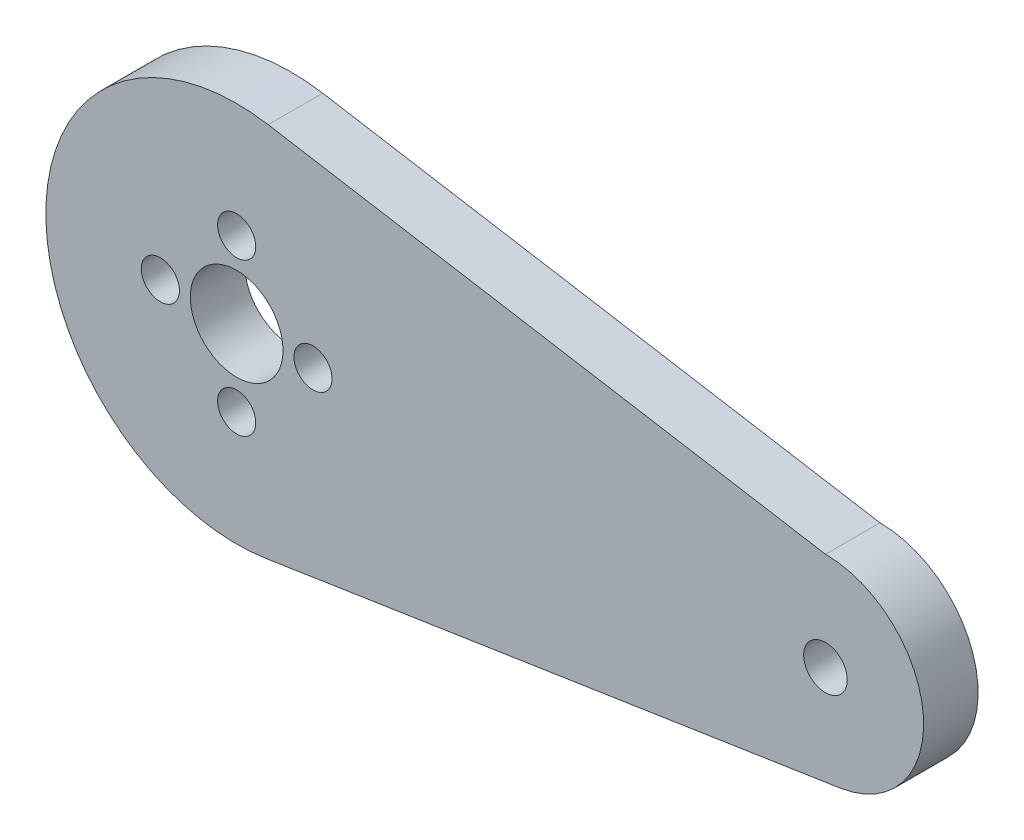
ISO-10303-21;
HEADER;
FILE_DESCRIPTION(('STEP AP214'),'2;1');
FILE_NAME('part.step','',(''),(''),'','','');
FILE_SCHEMA(('AUTOMOTIVE_DESIGN { 1 0 10303 214 1 1 1 1 }'));
ENDSEC;
DATA;
#1=APPLICATION_CONTEXT('core data for automotive mechanical design processes');
#2=APPLICATION_PROTOCOL_DEFINITION('international standard','automotive_design',2000,#1);
#3=PRODUCT_CONTEXT('',#1,'mechanical');
#4=PRODUCT('Part','Part','',(#3));
#5=PRODUCT_RELATED_PRODUCT_CATEGORY('part','',(#4));
#6=PRODUCT_DEFINITION_FORMATION('','',#4);
#7=PRODUCT_DEFINITION_CONTEXT('part definition',#1,'design');
#8=PRODUCT_DEFINITION('design','',#6,#7);
#9=PRODUCT_DEFINITION_SHAPE('','',#8);
#10=(LENGTH_UNIT() NAMED_UNIT(*) SI_UNIT(.MILLI.,.METRE.));
#11=(NAMED_UNIT(*) PLANE_ANGLE_UNIT() SI_UNIT($,.RADIAN.));
#12=(NAMED_UNIT(*) SI_UNIT($,.STERADIAN.) SOLID_ANGLE_UNIT());
#13=UNCERTAINTY_MEASURE_WITH_UNIT(LENGTH_MEASURE(1.E-05),#10,'distance_accuracy_value','');
#14=(GEOMETRIC_REPRESENTATION_CONTEXT(3) GLOBAL_UNCERTAINTY_ASSIGNED_CONTEXT((#13)) GLOBAL_UNIT_ASSIGNED_CONTEXT((#10,
#11,#12)) REPRESENTATION_CONTEXT('',''));
#15=CARTESIAN_POINT('',(0.,0.,0.));
#16=DIRECTION('',(0.,0.,1.));
#17=DIRECTION('',(1.,0.,0.));
#18=AXIS2_PLACEMENT_3D('',#15,#16,#17);
#19=CARTESIAN_POINT('',(-20.2199999704329,57.5799999999971,-5.));
#20=DIRECTION('',(0.,0.,1.));
#21=DIRECTION('',(1.,0.,0.));
#22=AXIS2_PLACEMENT_3D('',#19,#20,#21);
#23=CYLINDRICAL_SURFACE('',#22,17.500000000001);
#24=CARTESIAN_POINT('',(-20.2199999704329,57.5799999999971,0.));
#25=DIRECTION('',(0.,0.,1.));
#26=DIRECTION('',(1.,0.,0.));
#27=AXIS2_PLACEMENT_3D('',#24,#25,#26);
#28=CIRCLE('',#27,17.500000000001);
#29=CARTESIAN_POINT('',(-17.3288748871476,74.8395305774153,0.));
#30=VERTEX_POINT('',#29);
#31=CARTESIAN_POINT('',(-17.5619966812068,40.2830344130943,0.));
#32=VERTEX_POINT('',#31);
#33=EDGE_CURVE('E97',#30,#32,#28,.T.);
#34=ORIENTED_EDGE('',*,*,#33,.F.);
#35=DIRECTION('',(0.,0.,1.));
#36=VECTOR('',#35,1.);
#37=CARTESIAN_POINT('',(-17.3288748871476,74.8395305774153,-5.));
#38=LINE('',#37,#36);
#39=CARTESIAN_POINT('',(-17.3288748871476,74.8395305774153,-5.));
#40=VERTEX_POINT('',#39);
#41=EDGE_CURVE('E11',#40,#30,#38,.T.);
#42=ORIENTED_EDGE('',*,*,#41,.F.);
#43=CARTESIAN_POINT('',(-20.2199999704329,57.5799999999971,-5.));
#44=DIRECTION('',(0.,0.,1.));
#45=DIRECTION('',(1.,0.,0.));
#46=AXIS2_PLACEMENT_3D('',#43,#44,#45);
#47=CIRCLE('',#46,17.500000000001);
#48=CARTESIAN_POINT('',(-17.5619966812068,40.2830344130943,-5.));
#49=VERTEX_POINT('',#48);
#50=EDGE_CURVE('E90',#40,#49,#47,.T.);
#51=ORIENTED_EDGE('',*,*,#50,.T.);
#52=DIRECTION('',(0.,0.,1.));
#53=VECTOR('',#52,1.);
#54=CARTESIAN_POINT('',(-17.5619966812068,40.2830344130943,-5.));
#55=LINE('',#54,#53);
#56=EDGE_CURVE('E35',#49,#32,#55,.T.);
#57=ORIENTED_EDGE('',*,*,#56,.T.);
#58=EDGE_LOOP('',(#34,#42,#51,#57));
#59=FACE_BOUND('',#58,.T.);
#60=ADVANCED_FACE('F32',(#59),#23,.T.);
#61=CARTESIAN_POINT('',(-17.3288748871476,74.8395305774153,-5.));
#62=DIRECTION('',(0.165207147616288,0.986258890138127,0.));
#63=DIRECTION('',(-0.986258890138127,0.165207147616289,0.));
#64=AXIS2_PLACEMENT_3D('',#61,#62,#63);
#65=PLANE('',#64);
#66=DIRECTION('',(-0.986258890138127,0.165207147616288,0.));
#67=VECTOR('',#66,1.);
#68=CARTESIAN_POINT('',(-17.3288748871476,74.8395305774153,0.));
#69=LINE('',#68,#67);
#70=CARTESIAN_POINT('',(33.7800000295671,66.2783388585902,0.));
#71=VERTEX_POINT('',#70);
#72=EDGE_CURVE('E92',#71,#30,#69,.T.);
#73=ORIENTED_EDGE('',*,*,#72,.F.);
#74=DIRECTION('',(0.,0.,1.));
#75=VECTOR('',#74,1.);
#76=CARTESIAN_POINT('',(33.7800000295671,66.2783388585902,-5.));
#77=LINE('',#76,#75);
#78=CARTESIAN_POINT('',(33.7800000295671,66.2783388585902,-5.));
#79=VERTEX_POINT('',#78);
#80=EDGE_CURVE('E41',#79,#71,#77,.T.);
#81=ORIENTED_EDGE('',*,*,#80,.F.);
#82=DIRECTION('',(-0.986258890138127,0.165207147616288,0.));
#83=VECTOR('',#82,1.);
#84=CARTESIAN_POINT('',(-17.3288748871476,74.8395305774153,-5.));
#85=LINE('',#84,#83);
#86=EDGE_CURVE('E87',#79,#40,#85,.T.);
#87=ORIENTED_EDGE('',*,*,#86,.T.);
#88=ORIENTED_EDGE('',*,*,#41,.T.);
#89=EDGE_LOOP('',(#73,#81,#87,#88));
#90=FACE_BOUND('',#89,.T.);
#91=ADVANCED_FACE('F108',(#90),#65,.T.);
#92=CARTESIAN_POINT('',(33.7800000295671,57.2783388585902,-5.));
#93=DIRECTION('',(0.,0.,1.));
#94=DIRECTION('',(1.,0.,0.));
#95=AXIS2_PLACEMENT_3D('',#92,#93,#94);
#96=CYLINDRICAL_SURFACE('',#95,9.00000000000001);
#97=CARTESIAN_POINT('',(33.7800000295671,57.2783388585902,0.));
#98=DIRECTION('',(0.,0.,1.));
#99=DIRECTION('',(-1.,0.,0.));
#100=AXIS2_PLACEMENT_3D('',#97,#98,#99);
#101=CIRCLE('',#100,9.00000000000001);
#102=CARTESIAN_POINT('',(35.1469731497404,48.382756556755,0.));
#103=VERTEX_POINT('',#102);
#104=EDGE_CURVE('E82',#103,#71,#101,.T.);
#105=ORIENTED_EDGE('',*,*,#104,.F.);
#106=DIRECTION('',(0.,0.,1.));
#107=VECTOR('',#106,1.);
#108=CARTESIAN_POINT('',(35.1469731497404,48.382756556755,-5.));
#109=LINE('',#108,#107);
#110=CARTESIAN_POINT('',(35.1469731497404,48.382756556755,-5.));
#111=VERTEX_POINT('',#110);
#112=EDGE_CURVE('E77',#111,#103,#109,.T.);
#113=ORIENTED_EDGE('',*,*,#112,.F.);
#114=CARTESIAN_POINT('',(33.7800000295671,57.2783388585902,-5.));
#115=DIRECTION('',(0.,0.,1.));
#116=DIRECTION('',(-1.,0.,0.));
#117=AXIS2_PLACEMENT_3D('',#114,#115,#116);
#118=CIRCLE('',#117,9.00000000000001);
#119=EDGE_CURVE('E80',#111,#79,#118,.T.);
#120=ORIENTED_EDGE('',*,*,#119,.T.);
#121=ORIENTED_EDGE('',*,*,#80,.T.);
#122=EDGE_LOOP('',(#105,#113,#120,#121));
#123=FACE_BOUND('',#122,.T.);
#124=ADVANCED_FACE('F79',(#123),#96,.T.);
#125=CARTESIAN_POINT('',(35.1469731497404,48.382756556755,-5.));
#126=DIRECTION('',(0.151885902241479,-0.988398033537245,0.));
#127=DIRECTION('',(0.988398033537245,0.151885902241479,0.));
#128=AXIS2_PLACEMENT_3D('',#125,#126,#127);
#129=PLANE('',#128);
#130=DIRECTION('',(0.988398033537245,0.151885902241479,0.));
#131=VECTOR('',#130,1.);
#132=CARTESIAN_POINT('',(35.1469731497404,48.382756556755,0.));
#133=LINE('',#132,#131);
#134=EDGE_CURVE('E100',#32,#103,#133,.T.);
#135=ORIENTED_EDGE('',*,*,#134,.F.);
#136=ORIENTED_EDGE('',*,*,#56,.F.);
#137=DIRECTION('',(0.988398033537245,0.151885902241479,0.));
#138=VECTOR('',#137,1.);
#139=CARTESIAN_POINT('',(35.1469731497404,48.382756556755,-5.));
#140=LINE('',#139,#138);
#141=EDGE_CURVE('E86',#49,#111,#140,.T.);
#142=ORIENTED_EDGE('',*,*,#141,.T.);
#143=ORIENTED_EDGE('',*,*,#112,.T.);
#144=EDGE_LOOP('',(#135,#136,#142,#143));
#145=FACE_BOUND('',#144,.T.);
#146=ADVANCED_FACE('F89',(#145),#129,.T.);
#147=CARTESIAN_POINT('',(-20.2199999704329,57.5799999999971,-5.));
#148=DIRECTION('',(0.,0.,1.));
#149=DIRECTION('',(1.,0.,0.));
#150=AXIS2_PLACEMENT_3D('',#147,#148,#149);
#151=PLANE('',#150);
#152=CARTESIAN_POINT('',(-13.2199999704329,57.5799999999971,-5.));
#153=DIRECTION('',(0.,0.,1.));
#154=DIRECTION('',(1.,0.,0.));
#155=AXIS2_PLACEMENT_3D('',#152,#153,#154);
#156=CIRCLE('',#155,1.75);
#157=CARTESIAN_POINT('',(-11.4699999704329,57.5799999999971,-5.));
#158=VERTEX_POINT('',#157);
#159=EDGE_CURVE('E160',#158,#158,#156,.T.);
#160=ORIENTED_EDGE('',*,*,#159,.T.);
#161=EDGE_LOOP('',(#160));
#162=FACE_BOUND('',#161,.T.);
#163=CARTESIAN_POINT('',(-27.2199999704329,57.5799999999971,-5.));
#164=DIRECTION('',(0.,0.,1.));
#165=DIRECTION('',(1.,0.,0.));
#166=AXIS2_PLACEMENT_3D('',#163,#164,#165);
#167=CIRCLE('',#166,1.75);
#168=CARTESIAN_POINT('',(-25.4699999704329,57.5799999999971,-5.));
#169=VERTEX_POINT('',#168);
#170=EDGE_CURVE('E162',#169,#169,#167,.T.);
#171=ORIENTED_EDGE('',*,*,#170,.T.);
#172=EDGE_LOOP('',(#171));
#173=FACE_BOUND('',#172,.T.);
#174=CARTESIAN_POINT('',(-20.2199999704329,64.5799999999971,-5.));
#175=DIRECTION('',(0.,0.,1.));
#176=DIRECTION('',(1.,0.,0.));
#177=AXIS2_PLACEMENT_3D('',#174,#175,#176);
#178=CIRCLE('',#177,1.75);
#179=CARTESIAN_POINT('',(-18.4699999704329,64.5799999999971,-5.));
#180=VERTEX_POINT('',#179);
#181=EDGE_CURVE('E168',#180,#180,#178,.T.);
#182=ORIENTED_EDGE('',*,*,#181,.T.);
#183=EDGE_LOOP('',(#182));
#184=FACE_BOUND('',#183,.T.);
#185=CARTESIAN_POINT('',(-20.2199999704329,50.5799999999971,-5.));
#186=DIRECTION('',(0.,0.,1.));
#187=DIRECTION('',(1.,0.,0.));
#188=AXIS2_PLACEMENT_3D('',#185,#186,#187);
#189=CIRCLE('',#188,1.75);
#190=CARTESIAN_POINT('',(-18.4699999704329,50.5799999999971,-5.));
#191=VERTEX_POINT('',#190);
#192=EDGE_CURVE('E189',#191,#191,#189,.T.);
#193=ORIENTED_EDGE('',*,*,#192,.T.);
#194=EDGE_LOOP('',(#193));
#195=FACE_BOUND('',#194,.T.);
#196=CARTESIAN_POINT('',(33.7800000295671,57.2783388585902,-5.));
#197=DIRECTION('',(0.,0.,1.));
#198=DIRECTION('',(1.,0.,0.));
#199=AXIS2_PLACEMENT_3D('',#196,#197,#198);
#200=CIRCLE('',#199,2.);
#201=CARTESIAN_POINT('',(35.7800000295671,57.2783388585902,-5.));
#202=VERTEX_POINT('',#201);
#203=EDGE_CURVE('E165',#202,#202,#200,.T.);
#204=ORIENTED_EDGE('',*,*,#203,.T.);
#205=EDGE_LOOP('',(#204));
#206=FACE_BOUND('',#205,.T.);
#207=CARTESIAN_POINT('',(-20.2199999704329,57.5799999999971,-5.));
#208=DIRECTION('',(0.,0.,1.));
#209=DIRECTION('',(1.,0.,0.));
#210=AXIS2_PLACEMENT_3D('',#207,#208,#209);
#211=CIRCLE('',#210,4.25);
#212=CARTESIAN_POINT('',(-15.9699999704329,57.5799999999971,-5.));
#213=VERTEX_POINT('',#212);
#214=EDGE_CURVE('E101',#213,#213,#211,.T.);
#215=ORIENTED_EDGE('',*,*,#214,.T.);
#216=EDGE_LOOP('',(#215));
#217=FACE_BOUND('',#216,.T.);
#218=ORIENTED_EDGE('',*,*,#50,.F.);
#219=ORIENTED_EDGE('',*,*,#86,.F.);
#220=ORIENTED_EDGE('',*,*,#119,.F.);
#221=ORIENTED_EDGE('',*,*,#141,.F.);
#222=EDGE_LOOP('',(#218,#219,#220,#221));
#223=FACE_BOUND('',#222,.T.);
#224=ADVANCED_FACE('F85',(#162,#173,#184,#195,#206,#217,#223),#151,.F.);
#225=CARTESIAN_POINT('',(-20.2199999704329,57.5799999999971,0.));
#226=DIRECTION('',(0.,0.,1.));
#227=DIRECTION('',(1.,0.,0.));
#228=AXIS2_PLACEMENT_3D('',#225,#226,#227);
#229=PLANE('',#228);
#230=CARTESIAN_POINT('',(-13.2199999704329,57.5799999999971,0.));
#231=DIRECTION('',(0.,0.,1.));
#232=DIRECTION('',(1.,0.,0.));
#233=AXIS2_PLACEMENT_3D('',#230,#231,#232);
#234=CIRCLE('',#233,1.75);
#235=CARTESIAN_POINT('',(-11.4699999704329,57.5799999999971,0.));
#236=VERTEX_POINT('',#235);
#237=EDGE_CURVE('E158',#236,#236,#234,.T.);
#238=ORIENTED_EDGE('',*,*,#237,.F.);
#239=EDGE_LOOP('',(#238));
#240=FACE_BOUND('',#239,.T.);
#241=CARTESIAN_POINT('',(-27.2199999704329,57.5799999999971,0.));
#242=DIRECTION('',(0.,0.,1.));
#243=DIRECTION('',(1.,0.,0.));
#244=AXIS2_PLACEMENT_3D('',#241,#242,#243);
#245=CIRCLE('',#244,1.75);
#246=CARTESIAN_POINT('',(-25.4699999704329,57.5799999999971,0.));
#247=VERTEX_POINT('',#246);
#248=EDGE_CURVE('E198',#247,#247,#245,.T.);
#249=ORIENTED_EDGE('',*,*,#248,.F.);
#250=EDGE_LOOP('',(#249));
#251=FACE_BOUND('',#250,.T.);
#252=CARTESIAN_POINT('',(-20.2199999704329,64.5799999999971,0.));
#253=DIRECTION('',(0.,0.,1.));
#254=DIRECTION('',(1.,0.,0.));
#255=AXIS2_PLACEMENT_3D('',#252,#253,#254);
#256=CIRCLE('',#255,1.75);
#257=CARTESIAN_POINT('',(-18.4699999704329,64.5799999999971,0.));
#258=VERTEX_POINT('',#257);
#259=EDGE_CURVE('E195',#258,#258,#256,.T.);
#260=ORIENTED_EDGE('',*,*,#259,.F.);
#261=EDGE_LOOP('',(#260));
#262=FACE_BOUND('',#261,.T.);
#263=CARTESIAN_POINT('',(-20.2199999704329,50.5799999999971,0.));
#264=DIRECTION('',(0.,0.,1.));
#265=DIRECTION('',(1.,0.,0.));
#266=AXIS2_PLACEMENT_3D('',#263,#264,#265);
#267=CIRCLE('',#266,1.75);
#268=CARTESIAN_POINT('',(-18.4699999704329,50.5799999999971,0.));
#269=VERTEX_POINT('',#268);
#270=EDGE_CURVE('E192',#269,#269,#267,.T.);
#271=ORIENTED_EDGE('',*,*,#270,.F.);
#272=EDGE_LOOP('',(#271));
#273=FACE_BOUND('',#272,.T.);
#274=CARTESIAN_POINT('',(33.7800000295671,57.2783388585902,0.));
#275=DIRECTION('',(0.,0.,1.));
#276=DIRECTION('',(1.,0.,0.));
#277=AXIS2_PLACEMENT_3D('',#274,#275,#276);
#278=CIRCLE('',#277,2.);
#279=CARTESIAN_POINT('',(35.7800000295671,57.2783388585902,0.));
#280=VERTEX_POINT('',#279);
#281=EDGE_CURVE('E161',#280,#280,#278,.T.);
#282=ORIENTED_EDGE('',*,*,#281,.F.);
#283=EDGE_LOOP('',(#282));
#284=FACE_BOUND('',#283,.T.);
#285=CARTESIAN_POINT('',(-20.2199999704329,57.5799999999971,0.));
#286=DIRECTION('',(0.,0.,1.));
#287=DIRECTION('',(1.,0.,0.));
#288=AXIS2_PLACEMENT_3D('',#285,#286,#287);
#289=CIRCLE('',#288,4.25);
#290=CARTESIAN_POINT('',(-15.9699999704329,57.5799999999971,0.));
#291=VERTEX_POINT('',#290);
#292=EDGE_CURVE('E173',#291,#291,#289,.T.);
#293=ORIENTED_EDGE('',*,*,#292,.F.);
#294=EDGE_LOOP('',(#293));
#295=FACE_BOUND('',#294,.T.);
#296=ORIENTED_EDGE('',*,*,#33,.T.);
#297=ORIENTED_EDGE('',*,*,#134,.T.);
#298=ORIENTED_EDGE('',*,*,#104,.T.);
#299=ORIENTED_EDGE('',*,*,#72,.T.);
#300=EDGE_LOOP('',(#296,#297,#298,#299));
#301=FACE_BOUND('',#300,.T.);
#302=ADVANCED_FACE('F107',(#240,#251,#262,#273,#284,#295,#301),#229,.T.);
#303=CARTESIAN_POINT('',(-20.2199999704329,57.5799999999971,-5.));
#304=DIRECTION('',(0.,0.,1.));
#305=DIRECTION('',(1.,0.,0.));
#306=AXIS2_PLACEMENT_3D('',#303,#304,#305);
#307=CYLINDRICAL_SURFACE('',#306,4.25);
#308=ORIENTED_EDGE('',*,*,#214,.F.);
#309=EDGE_LOOP('',(#308));
#310=FACE_BOUND('',#309,.T.);
#311=ORIENTED_EDGE('',*,*,#292,.T.);
#312=EDGE_LOOP('',(#311));
#313=FACE_BOUND('',#312,.T.);
#314=ADVANCED_FACE('F126',(#310,#313),#307,.F.);
#315=CARTESIAN_POINT('',(33.7800000295671,57.2783388585902,-5.));
#316=DIRECTION('',(0.,0.,1.));
#317=DIRECTION('',(1.,0.,0.));
#318=AXIS2_PLACEMENT_3D('',#315,#316,#317);
#319=CYLINDRICAL_SURFACE('',#318,2.);
#320=ORIENTED_EDGE('',*,*,#203,.F.);
#321=EDGE_LOOP('',(#320));
#322=FACE_BOUND('',#321,.T.);
#323=ORIENTED_EDGE('',*,*,#281,.T.);
#324=EDGE_LOOP('',(#323));
#325=FACE_BOUND('',#324,.T.);
#326=ADVANCED_FACE('F133',(#322,#325),#319,.F.);
#327=CARTESIAN_POINT('',(-20.2199999704329,50.5799999999971,-10.));
#328=DIRECTION('',(0.,0.,1.));
#329=DIRECTION('',(1.,0.,0.));
#330=AXIS2_PLACEMENT_3D('',#327,#328,#329);
#331=CYLINDRICAL_SURFACE('',#330,1.75);
#332=ORIENTED_EDGE('',*,*,#270,.T.);
#333=EDGE_LOOP('',(#332));
#334=FACE_BOUND('',#333,.T.);
#335=ORIENTED_EDGE('',*,*,#192,.F.);
#336=EDGE_LOOP('',(#335));
#337=FACE_BOUND('',#336,.T.);
#338=ADVANCED_FACE('F137',(#334,#337),#331,.F.);
#339=CARTESIAN_POINT('',(-20.2199999704329,64.5799999999971,-10.));
#340=DIRECTION('',(0.,0.,1.));
#341=DIRECTION('',(1.,0.,0.));
#342=AXIS2_PLACEMENT_3D('',#339,#340,#341);
#343=CYLINDRICAL_SURFACE('',#342,1.75);
#344=ORIENTED_EDGE('',*,*,#259,.T.);
#345=EDGE_LOOP('',(#344));
#346=FACE_BOUND('',#345,.T.);
#347=ORIENTED_EDGE('',*,*,#181,.F.);
#348=EDGE_LOOP('',(#347));
#349=FACE_BOUND('',#348,.T.);
#350=ADVANCED_FACE('F141',(#346,#349),#343,.F.);
#351=CARTESIAN_POINT('',(-27.2199999704329,57.5799999999971,-10.));
#352=DIRECTION('',(0.,0.,1.));
#353=DIRECTION('',(1.,0.,0.));
#354=AXIS2_PLACEMENT_3D('',#351,#352,#353);
#355=CYLINDRICAL_SURFACE('',#354,1.75);
#356=ORIENTED_EDGE('',*,*,#248,.T.);
#357=EDGE_LOOP('',(#356));
#358=FACE_BOUND('',#357,.T.);
#359=ORIENTED_EDGE('',*,*,#170,.F.);
#360=EDGE_LOOP('',(#359));
#361=FACE_BOUND('',#360,.T.);
#362=ADVANCED_FACE('F145',(#358,#361),#355,.F.);
#363=CARTESIAN_POINT('',(-13.2199999704329,57.5799999999971,-10.));
#364=DIRECTION('',(0.,0.,1.));
#365=DIRECTION('',(1.,0.,0.));
#366=AXIS2_PLACEMENT_3D('',#363,#364,#365);
#367=CYLINDRICAL_SURFACE('',#366,1.75);
#368=ORIENTED_EDGE('',*,*,#237,.T.);
#369=EDGE_LOOP('',(#368));
#370=FACE_BOUND('',#369,.T.);
#371=ORIENTED_EDGE('',*,*,#159,.F.);
#372=EDGE_LOOP('',(#371));
#373=FACE_BOUND('',#372,.T.);
#374=ADVANCED_FACE('F149',(#370,#373),#367,.F.);
#375=CLOSED_SHELL('',(#60,#91,#124,#146,#224,#302,#314,#326,#338,#350,#362,#374));
#376=MANIFOLD_SOLID_BREP('B2',#375);
#377=ADVANCED_BREP_SHAPE_REPRESENTATION('',(#18,#376),#14);
#378=SHAPE_DEFINITION_REPRESENTATION(#9,#377);
ENDSEC;
END-ISO-10303-21;
